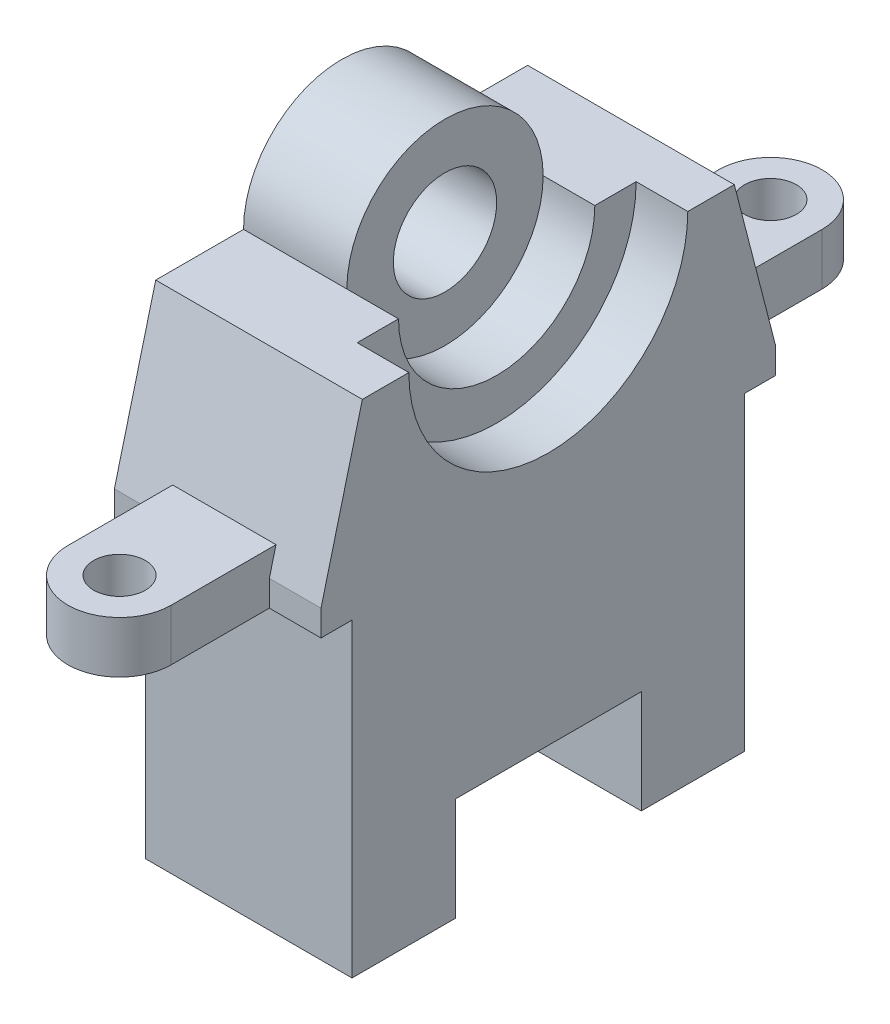
ISO-10303-21;
HEADER;
FILE_DESCRIPTION(('STEP AP214'),'2;1');
FILE_NAME('part.step','',(''),(''),'','','');
FILE_SCHEMA(('AUTOMOTIVE_DESIGN { 1 0 10303 214 1 1 1 1 }'));
ENDSEC;
DATA;
#1=APPLICATION_CONTEXT('core data for automotive mechanical design processes');
#2=APPLICATION_PROTOCOL_DEFINITION('international standard','automotive_design',2000,#1);
#3=PRODUCT_CONTEXT('',#1,'mechanical');
#4=PRODUCT('Part','Part','',(#3));
#5=PRODUCT_RELATED_PRODUCT_CATEGORY('part','',(#4));
#6=PRODUCT_DEFINITION_FORMATION('','',#4);
#7=PRODUCT_DEFINITION_CONTEXT('part definition',#1,'design');
#8=PRODUCT_DEFINITION('design','',#6,#7);
#9=PRODUCT_DEFINITION_SHAPE('','',#8);
#10=(LENGTH_UNIT() NAMED_UNIT(*) SI_UNIT(.MILLI.,.METRE.));
#11=(NAMED_UNIT(*) PLANE_ANGLE_UNIT() SI_UNIT($,.RADIAN.));
#12=(NAMED_UNIT(*) SI_UNIT($,.STERADIAN.) SOLID_ANGLE_UNIT());
#13=UNCERTAINTY_MEASURE_WITH_UNIT(LENGTH_MEASURE(1.E-05),#10,'distance_accuracy_value','');
#14=(GEOMETRIC_REPRESENTATION_CONTEXT(3) GLOBAL_UNCERTAINTY_ASSIGNED_CONTEXT((#13)) GLOBAL_UNIT_ASSIGNED_CONTEXT((#10,
#11,#12)) REPRESENTATION_CONTEXT('',''));
#15=CARTESIAN_POINT('',(0.,0.,0.));
#16=DIRECTION('',(0.,0.,1.));
#17=DIRECTION('',(1.,0.,0.));
#18=AXIS2_PLACEMENT_3D('',#15,#16,#17);
#19=CARTESIAN_POINT('',(40.,0.,44.));
#20=DIRECTION('',(0.,0.,-1.));
#21=DIRECTION('',(0.,1.,0.));
#22=AXIS2_PLACEMENT_3D('',#19,#20,#21);
#23=PLANE('',#22);
#24=DIRECTION('',(-1.,0.,0.));
#25=VECTOR('',#24,1.);
#26=CARTESIAN_POINT('',(40.,-31.,44.));
#27=LINE('',#26,#25);
#28=CARTESIAN_POINT('',(40.,-31.,44.));
#29=VERTEX_POINT('',#28);
#30=CARTESIAN_POINT('',(30.,-31.,44.));
#31=VERTEX_POINT('',#30);
#32=EDGE_CURVE('E494',#29,#31,#27,.T.);
#33=ORIENTED_EDGE('',*,*,#32,.T.);
#34=DIRECTION('',(0.,-1.,0.));
#35=VECTOR('',#34,1.);
#36=CARTESIAN_POINT('',(30.,0.,44.));
#37=LINE('',#36,#35);
#38=CARTESIAN_POINT('',(30.,-36.0000000000001,44.));
#39=VERTEX_POINT('',#38);
#40=EDGE_CURVE('E291',#31,#39,#37,.T.);
#41=ORIENTED_EDGE('',*,*,#40,.T.);
#42=DIRECTION('',(-1.,0.,0.));
#43=VECTOR('',#42,1.);
#44=CARTESIAN_POINT('',(40.,-36.,44.));
#45=LINE('',#44,#43);
#46=CARTESIAN_POINT('',(40.,-36.,44.));
#47=VERTEX_POINT('',#46);
#48=EDGE_CURVE('E244',#47,#39,#45,.T.);
#49=ORIENTED_EDGE('',*,*,#48,.F.);
#50=DIRECTION('',(0.,-1.,0.));
#51=VECTOR('',#50,1.);
#52=CARTESIAN_POINT('',(40.,0.,44.));
#53=LINE('',#52,#51);
#54=EDGE_CURVE('E352',#29,#47,#53,.T.);
#55=ORIENTED_EDGE('',*,*,#54,.F.);
#56=EDGE_LOOP('',(#33,#41,#49,#55));
#57=FACE_BOUND('',#56,.T.);
#58=ADVANCED_FACE('F45',(#57),#23,.F.);
#59=CARTESIAN_POINT('',(40.,0.,-44.));
#60=DIRECTION('',(0.,0.,-1.));
#61=DIRECTION('',(0.,1.,0.));
#62=AXIS2_PLACEMENT_3D('',#59,#60,#61);
#63=PLANE('',#62);
#64=DIRECTION('',(0.,-1.,0.));
#65=VECTOR('',#64,1.);
#66=CARTESIAN_POINT('',(30.,0.,-44.));
#67=LINE('',#66,#65);
#68=CARTESIAN_POINT('',(30.,-31.,-44.));
#69=VERTEX_POINT('',#68);
#70=CARTESIAN_POINT('',(30.,-36.,-44.));
#71=VERTEX_POINT('',#70);
#72=EDGE_CURVE('E337',#69,#71,#67,.T.);
#73=ORIENTED_EDGE('',*,*,#72,.F.);
#74=DIRECTION('',(-1.,0.,0.));
#75=VECTOR('',#74,1.);
#76=CARTESIAN_POINT('',(40.,-31.,-44.));
#77=LINE('',#76,#75);
#78=CARTESIAN_POINT('',(40.,-31.,-44.));
#79=VERTEX_POINT('',#78);
#80=EDGE_CURVE('E454',#79,#69,#77,.T.);
#81=ORIENTED_EDGE('',*,*,#80,.F.);
#82=DIRECTION('',(0.,-1.,0.));
#83=VECTOR('',#82,1.);
#84=CARTESIAN_POINT('',(40.,0.,-44.));
#85=LINE('',#84,#83);
#86=CARTESIAN_POINT('',(40.,-36.,-44.));
#87=VERTEX_POINT('',#86);
#88=EDGE_CURVE('E387',#79,#87,#85,.T.);
#89=ORIENTED_EDGE('',*,*,#88,.T.);
#90=DIRECTION('',(-1.,0.,0.));
#91=VECTOR('',#90,1.);
#92=CARTESIAN_POINT('',(40.,-36.,-44.));
#93=LINE('',#92,#91);
#94=EDGE_CURVE('E459',#87,#71,#93,.T.);
#95=ORIENTED_EDGE('',*,*,#94,.T.);
#96=EDGE_LOOP('',(#73,#81,#89,#95));
#97=FACE_BOUND('',#96,.T.);
#98=ADVANCED_FACE('F573',(#97),#63,.T.);
#99=CARTESIAN_POINT('',(20.,0.,0.));
#100=DIRECTION('',(-1.,0.,0.));
#101=DIRECTION('',(0.,0.,1.));
#102=AXIS2_PLACEMENT_3D('',#99,#100,#101);
#103=CYLINDRICAL_SURFACE('',#102,10.);
#104=CARTESIAN_POINT('',(20.,0.,0.));
#105=DIRECTION('',(1.,0.,0.));
#106=DIRECTION('',(0.,0.,-1.));
#107=AXIS2_PLACEMENT_3D('',#104,#105,#106);
#108=CIRCLE('',#107,10.);
#109=CARTESIAN_POINT('',(20.,0.,-10.));
#110=VERTEX_POINT('',#109);
#111=EDGE_CURVE('E544',#110,#110,#108,.T.);
#112=ORIENTED_EDGE('',*,*,#111,.T.);
#113=EDGE_LOOP('',(#112));
#114=FACE_BOUND('',#113,.T.);
#115=CARTESIAN_POINT('',(0.,0.,0.));
#116=DIRECTION('',(1.,0.,0.));
#117=DIRECTION('',(0.,0.,-1.));
#118=AXIS2_PLACEMENT_3D('',#115,#116,#117);
#119=CIRCLE('',#118,10.);
#120=CARTESIAN_POINT('',(0.,0.,-10.));
#121=VERTEX_POINT('',#120);
#122=EDGE_CURVE('E543',#121,#121,#119,.T.);
#123=ORIENTED_EDGE('',*,*,#122,.F.);
#124=EDGE_LOOP('',(#123));
#125=FACE_BOUND('',#124,.T.);
#126=ADVANCED_FACE('F47',(#114,#125),#103,.F.);
#127=CARTESIAN_POINT('',(20.,0.,0.));
#128=DIRECTION('',(-1.,0.,0.));
#129=DIRECTION('',(0.,0.,1.));
#130=AXIS2_PLACEMENT_3D('',#127,#128,#129);
#131=CYLINDRICAL_SURFACE('',#130,19.);
#132=CARTESIAN_POINT('',(0.,0.,0.));
#133=DIRECTION('',(1.,0.,0.));
#134=DIRECTION('',(0.,0.,-1.));
#135=AXIS2_PLACEMENT_3D('',#132,#133,#134);
#136=CIRCLE('',#135,19.);
#137=CARTESIAN_POINT('',(0.,0.,-19.));
#138=VERTEX_POINT('',#137);
#139=CARTESIAN_POINT('',(0.,0.,19.));
#140=VERTEX_POINT('',#139);
#141=EDGE_CURVE('E549',#138,#140,#136,.T.);
#142=ORIENTED_EDGE('',*,*,#141,.T.);
#143=DIRECTION('',(-1.,0.,0.));
#144=VECTOR('',#143,1.);
#145=CARTESIAN_POINT('',(30.,0.,19.));
#146=LINE('',#145,#144);
#147=CARTESIAN_POINT('',(20.,0.,19.));
#148=VERTEX_POINT('',#147);
#149=EDGE_CURVE('E524',#148,#140,#146,.T.);
#150=ORIENTED_EDGE('',*,*,#149,.F.);
#151=CARTESIAN_POINT('',(20.,0.,0.));
#152=DIRECTION('',(1.,0.,0.));
#153=DIRECTION('',(0.,0.,-1.));
#154=AXIS2_PLACEMENT_3D('',#151,#152,#153);
#155=CIRCLE('',#154,19.);
#156=CARTESIAN_POINT('',(20.,0.,-19.));
#157=VERTEX_POINT('',#156);
#158=EDGE_CURVE('E548',#157,#148,#155,.T.);
#159=ORIENTED_EDGE('',*,*,#158,.F.);
#160=DIRECTION('',(-1.,0.,0.));
#161=VECTOR('',#160,1.);
#162=CARTESIAN_POINT('',(30.,0.,-19.));
#163=LINE('',#162,#161);
#164=EDGE_CURVE('E534',#157,#138,#163,.T.);
#165=ORIENTED_EDGE('',*,*,#164,.T.);
#166=EDGE_LOOP('',(#142,#150,#159,#165));
#167=FACE_BOUND('',#166,.T.);
#168=ADVANCED_FACE('F663',(#167),#131,.T.);
#169=CARTESIAN_POINT('',(20.,0.,0.));
#170=DIRECTION('',(1.,0.,0.));
#171=DIRECTION('',(0.,0.,-1.));
#172=AXIS2_PLACEMENT_3D('',#169,#170,#171);
#173=PLANE('',#172);
#174=ORIENTED_EDGE('',*,*,#111,.F.);
#175=EDGE_LOOP('',(#174));
#176=FACE_BOUND('',#175,.T.);
#177=ORIENTED_EDGE('',*,*,#158,.T.);
#178=CARTESIAN_POINT('',(20.,0.,0.));
#179=DIRECTION('',(1.,0.,0.));
#180=DIRECTION('',(0.,0.,-1.));
#181=AXIS2_PLACEMENT_3D('',#178,#179,#180);
#182=CIRCLE('',#181,19.);
#183=EDGE_CURVE('E539',#157,#148,#182,.F.);
#184=ORIENTED_EDGE('',*,*,#183,.F.);
#185=EDGE_LOOP('',(#177,#184));
#186=FACE_BOUND('',#185,.T.);
#187=ADVANCED_FACE('F718',(#176,#186),#173,.T.);
#188=CARTESIAN_POINT('',(0.,0.,0.));
#189=DIRECTION('',(1.,0.,0.));
#190=DIRECTION('',(0.,0.,-1.));
#191=AXIS2_PLACEMENT_3D('',#188,#189,#190);
#192=PLANE('',#191);
#193=ORIENTED_EDGE('',*,*,#122,.T.);
#194=EDGE_LOOP('',(#193));
#195=FACE_BOUND('',#194,.T.);
#196=ORIENTED_EDGE('',*,*,#141,.F.);
#197=DIRECTION('',(0.,0.,-1.));
#198=VECTOR('',#197,1.);
#199=CARTESIAN_POINT('',(0.,0.,0.));
#200=LINE('',#199,#198);
#201=CARTESIAN_POINT('',(0.,0.,-36.));
#202=VERTEX_POINT('',#201);
#203=EDGE_CURVE('E512',#138,#202,#200,.T.);
#204=ORIENTED_EDGE('',*,*,#203,.T.);
#205=DIRECTION('',(0.,-0.968277323709358,-0.24987801902177));
#206=VECTOR('',#205,1.);
#207=CARTESIAN_POINT('',(0.,8.71024390243903,-33.7521951219512));
#208=LINE('',#207,#206);
#209=CARTESIAN_POINT('',(0.,-31.,-44.));
#210=VERTEX_POINT('',#209);
#211=EDGE_CURVE('E346',#202,#210,#208,.T.);
#212=ORIENTED_EDGE('',*,*,#211,.T.);
#213=DIRECTION('',(0.,-1.,0.));
#214=VECTOR('',#213,1.);
#215=CARTESIAN_POINT('',(0.,0.,-44.));
#216=LINE('',#215,#214);
#217=CARTESIAN_POINT('',(0.,-36.,-44.));
#218=VERTEX_POINT('',#217);
#219=EDGE_CURVE('E440',#210,#218,#216,.T.);
#220=ORIENTED_EDGE('',*,*,#219,.T.);
#221=DIRECTION('',(0.,0.,1.));
#222=VECTOR('',#221,1.);
#223=CARTESIAN_POINT('',(0.,-36.,0.));
#224=LINE('',#223,#222);
#225=CARTESIAN_POINT('',(0.,-36.,-38.));
#226=VERTEX_POINT('',#225);
#227=EDGE_CURVE('E436',#218,#226,#224,.T.);
#228=ORIENTED_EDGE('',*,*,#227,.T.);
#229=DIRECTION('',(0.,-1.,0.));
#230=VECTOR('',#229,1.);
#231=CARTESIAN_POINT('',(0.,0.,-38.));
#232=LINE('',#231,#230);
#233=CARTESIAN_POINT('',(0.,-96.,-38.));
#234=VERTEX_POINT('',#233);
#235=EDGE_CURVE('E432',#226,#234,#232,.T.);
#236=ORIENTED_EDGE('',*,*,#235,.T.);
#237=DIRECTION('',(0.,0.,1.));
#238=VECTOR('',#237,1.);
#239=CARTESIAN_POINT('',(0.,-96.,0.));
#240=LINE('',#239,#238);
#241=CARTESIAN_POINT('',(0.,-96.,-18.));
#242=VERTEX_POINT('',#241);
#243=EDGE_CURVE('E428',#234,#242,#240,.T.);
#244=ORIENTED_EDGE('',*,*,#243,.T.);
#245=DIRECTION('',(0.,1.,0.));
#246=VECTOR('',#245,1.);
#247=CARTESIAN_POINT('',(0.,0.,-18.));
#248=LINE('',#247,#246);
#249=CARTESIAN_POINT('',(0.,-76.,-18.));
#250=VERTEX_POINT('',#249);
#251=EDGE_CURVE('E424',#242,#250,#248,.T.);
#252=ORIENTED_EDGE('',*,*,#251,.T.);
#253=DIRECTION('',(0.,0.,1.));
#254=VECTOR('',#253,1.);
#255=CARTESIAN_POINT('',(0.,-76.,0.));
#256=LINE('',#255,#254);
#257=CARTESIAN_POINT('',(0.,-76.,18.));
#258=VERTEX_POINT('',#257);
#259=EDGE_CURVE('E420',#250,#258,#256,.T.);
#260=ORIENTED_EDGE('',*,*,#259,.T.);
#261=DIRECTION('',(0.,1.,0.));
#262=VECTOR('',#261,1.);
#263=CARTESIAN_POINT('',(0.,0.,18.));
#264=LINE('',#263,#262);
#265=CARTESIAN_POINT('',(0.,-96.,18.));
#266=VERTEX_POINT('',#265);
#267=EDGE_CURVE('E416',#266,#258,#264,.T.);
#268=ORIENTED_EDGE('',*,*,#267,.F.);
#269=DIRECTION('',(0.,0.,-1.));
#270=VECTOR('',#269,1.);
#271=CARTESIAN_POINT('',(0.,-96.,0.));
#272=LINE('',#271,#270);
#273=CARTESIAN_POINT('',(0.,-96.,38.));
#274=VERTEX_POINT('',#273);
#275=EDGE_CURVE('E413',#274,#266,#272,.T.);
#276=ORIENTED_EDGE('',*,*,#275,.F.);
#277=DIRECTION('',(0.,-1.,0.));
#278=VECTOR('',#277,1.);
#279=CARTESIAN_POINT('',(0.,0.,38.));
#280=LINE('',#279,#278);
#281=CARTESIAN_POINT('',(0.,-36.,38.));
#282=VERTEX_POINT('',#281);
#283=EDGE_CURVE('E410',#282,#274,#280,.T.);
#284=ORIENTED_EDGE('',*,*,#283,.F.);
#285=DIRECTION('',(0.,0.,-1.));
#286=VECTOR('',#285,1.);
#287=CARTESIAN_POINT('',(0.,-36.,0.));
#288=LINE('',#287,#286);
#289=CARTESIAN_POINT('',(0.,-36.,44.));
#290=VERTEX_POINT('',#289);
#291=EDGE_CURVE('E407',#290,#282,#288,.T.);
#292=ORIENTED_EDGE('',*,*,#291,.F.);
#293=DIRECTION('',(0.,-1.,0.));
#294=VECTOR('',#293,1.);
#295=CARTESIAN_POINT('',(0.,0.,44.));
#296=LINE('',#295,#294);
#297=CARTESIAN_POINT('',(0.,-31.,44.));
#298=VERTEX_POINT('',#297);
#299=EDGE_CURVE('E403',#298,#290,#296,.T.);
#300=ORIENTED_EDGE('',*,*,#299,.F.);
#301=DIRECTION('',(0.,-0.968277323709358,0.24987801902177));
#302=VECTOR('',#301,1.);
#303=CARTESIAN_POINT('',(0.,8.71024390243903,33.7521951219512));
#304=LINE('',#303,#302);
#305=CARTESIAN_POINT('',(0.,0.,36.));
#306=VERTEX_POINT('',#305);
#307=EDGE_CURVE('E340',#306,#298,#304,.T.);
#308=ORIENTED_EDGE('',*,*,#307,.F.);
#309=DIRECTION('',(0.,0.,-1.));
#310=VECTOR('',#309,1.);
#311=CARTESIAN_POINT('',(0.,0.,0.));
#312=LINE('',#311,#310);
#313=EDGE_CURVE('E506',#306,#140,#312,.T.);
#314=ORIENTED_EDGE('',*,*,#313,.T.);
#315=EDGE_LOOP('',(#196,#204,#212,#220,#228,#236,#244,#252,#260,#268,#276,#284,#292,#300,#308,#314));
#316=FACE_BOUND('',#315,.T.);
#317=ADVANCED_FACE('F665',(#195,#316),#192,.F.);
#318=CARTESIAN_POINT('',(30.,0.,0.));
#319=DIRECTION('',(0.,1.,0.));
#320=DIRECTION('',(0.,0.,1.));
#321=AXIS2_PLACEMENT_3D('',#318,#319,#320);
#322=PLANE('',#321);
#323=ORIENTED_EDGE('',*,*,#313,.F.);
#324=DIRECTION('',(-1.,0.,0.));
#325=VECTOR('',#324,1.);
#326=CARTESIAN_POINT('',(40.,0.,36.));
#327=LINE('',#326,#325);
#328=CARTESIAN_POINT('',(40.,0.,36.));
#329=VERTEX_POINT('',#328);
#330=EDGE_CURVE('E498',#329,#306,#327,.T.);
#331=ORIENTED_EDGE('',*,*,#330,.F.);
#332=DIRECTION('',(0.,0.,1.));
#333=VECTOR('',#332,1.);
#334=CARTESIAN_POINT('',(40.,0.,0.));
#335=LINE('',#334,#333);
#336=CARTESIAN_POINT('',(40.,0.,27.));
#337=VERTEX_POINT('',#336);
#338=EDGE_CURVE('E345',#337,#329,#335,.T.);
#339=ORIENTED_EDGE('',*,*,#338,.F.);
#340=DIRECTION('',(-1.,0.,0.));
#341=VECTOR('',#340,1.);
#342=CARTESIAN_POINT('',(40.,0.,27.));
#343=LINE('',#342,#341);
#344=CARTESIAN_POINT('',(30.,0.,27.));
#345=VERTEX_POINT('',#344);
#346=EDGE_CURVE('E502',#337,#345,#343,.T.);
#347=ORIENTED_EDGE('',*,*,#346,.T.);
#348=DIRECTION('',(0.,0.,-1.));
#349=VECTOR('',#348,1.);
#350=CARTESIAN_POINT('',(30.,0.,0.));
#351=LINE('',#350,#349);
#352=CARTESIAN_POINT('',(30.,0.,19.));
#353=VERTEX_POINT('',#352);
#354=EDGE_CURVE('E507',#345,#353,#351,.T.);
#355=ORIENTED_EDGE('',*,*,#354,.T.);
#356=EDGE_CURVE('E530',#353,#148,#146,.T.);
#357=ORIENTED_EDGE('',*,*,#356,.T.);
#358=ORIENTED_EDGE('',*,*,#149,.T.);
#359=EDGE_LOOP('',(#323,#331,#339,#347,#355,#357,#358));
#360=FACE_BOUND('',#359,.T.);
#361=ADVANCED_FACE('F594',(#360),#322,.T.);
#362=CARTESIAN_POINT('',(30.,0.,0.));
#363=DIRECTION('',(0.,1.,0.));
#364=DIRECTION('',(0.,0.,1.));
#365=AXIS2_PLACEMENT_3D('',#362,#363,#364);
#366=PLANE('',#365);
#367=ORIENTED_EDGE('',*,*,#203,.F.);
#368=ORIENTED_EDGE('',*,*,#164,.F.);
#369=CARTESIAN_POINT('',(30.,0.,-19.));
#370=VERTEX_POINT('',#369);
#371=EDGE_CURVE('E535',#370,#157,#163,.T.);
#372=ORIENTED_EDGE('',*,*,#371,.F.);
#373=DIRECTION('',(0.,0.,-1.));
#374=VECTOR('',#373,1.);
#375=CARTESIAN_POINT('',(30.,0.,0.));
#376=LINE('',#375,#374);
#377=CARTESIAN_POINT('',(30.,0.,-27.));
#378=VERTEX_POINT('',#377);
#379=EDGE_CURVE('E516',#370,#378,#376,.T.);
#380=ORIENTED_EDGE('',*,*,#379,.T.);
#381=DIRECTION('',(-1.,0.,0.));
#382=VECTOR('',#381,1.);
#383=CARTESIAN_POINT('',(40.,0.,-27.));
#384=LINE('',#383,#382);
#385=CARTESIAN_POINT('',(40.,0.,-27.));
#386=VERTEX_POINT('',#385);
#387=EDGE_CURVE('E399',#386,#378,#384,.T.);
#388=ORIENTED_EDGE('',*,*,#387,.F.);
#389=DIRECTION('',(0.,0.,-1.));
#390=VECTOR('',#389,1.);
#391=CARTESIAN_POINT('',(40.,0.,0.));
#392=LINE('',#391,#390);
#393=CARTESIAN_POINT('',(40.,0.,-36.));
#394=VERTEX_POINT('',#393);
#395=EDGE_CURVE('E395',#386,#394,#392,.T.);
#396=ORIENTED_EDGE('',*,*,#395,.T.);
#397=DIRECTION('',(-1.,0.,0.));
#398=VECTOR('',#397,1.);
#399=CARTESIAN_POINT('',(40.,0.,-36.));
#400=LINE('',#399,#398);
#401=EDGE_CURVE('E449',#394,#202,#400,.T.);
#402=ORIENTED_EDGE('',*,*,#401,.T.);
#403=EDGE_LOOP('',(#367,#368,#372,#380,#388,#396,#402));
#404=FACE_BOUND('',#403,.T.);
#405=ADVANCED_FACE('F585',(#404),#366,.T.);
#406=CARTESIAN_POINT('',(30.,0.,0.));
#407=DIRECTION('',(-1.,0.,0.));
#408=DIRECTION('',(0.,0.,1.));
#409=AXIS2_PLACEMENT_3D('',#406,#407,#408);
#410=CYLINDRICAL_SURFACE('',#409,19.);
#411=ORIENTED_EDGE('',*,*,#371,.T.);
#412=ORIENTED_EDGE('',*,*,#183,.T.);
#413=ORIENTED_EDGE('',*,*,#356,.F.);
#414=CARTESIAN_POINT('',(30.,0.,0.));
#415=DIRECTION('',(1.,0.,0.));
#416=DIRECTION('',(0.,0.,-1.));
#417=AXIS2_PLACEMENT_3D('',#414,#415,#416);
#418=CIRCLE('',#417,19.);
#419=EDGE_CURVE('E520',#353,#370,#418,.T.);
#420=ORIENTED_EDGE('',*,*,#419,.T.);
#421=EDGE_LOOP('',(#411,#412,#413,#420));
#422=FACE_BOUND('',#421,.T.);
#423=ADVANCED_FACE('F709',(#422),#410,.F.);
#424=CARTESIAN_POINT('',(30.,0.,0.));
#425=DIRECTION('',(1.,0.,0.));
#426=DIRECTION('',(0.,0.,-1.));
#427=AXIS2_PLACEMENT_3D('',#424,#425,#426);
#428=PLANE('',#427);
#429=ORIENTED_EDGE('',*,*,#354,.F.);
#430=CARTESIAN_POINT('',(30.,0.,0.));
#431=DIRECTION('',(1.,0.,0.));
#432=DIRECTION('',(0.,0.,-1.));
#433=AXIS2_PLACEMENT_3D('',#430,#431,#432);
#434=CIRCLE('',#433,27.);
#435=EDGE_CURVE('E511',#345,#378,#434,.T.);
#436=ORIENTED_EDGE('',*,*,#435,.T.);
#437=ORIENTED_EDGE('',*,*,#379,.F.);
#438=ORIENTED_EDGE('',*,*,#419,.F.);
#439=EDGE_LOOP('',(#429,#436,#437,#438));
#440=FACE_BOUND('',#439,.T.);
#441=ADVANCED_FACE('F704',(#440),#428,.T.);
#442=CARTESIAN_POINT('',(40.,0.,0.));
#443=DIRECTION('',(-1.,0.,0.));
#444=DIRECTION('',(0.,0.,1.));
#445=AXIS2_PLACEMENT_3D('',#442,#443,#444);
#446=CYLINDRICAL_SURFACE('',#445,27.);
#447=ORIENTED_EDGE('',*,*,#387,.T.);
#448=ORIENTED_EDGE('',*,*,#435,.F.);
#449=ORIENTED_EDGE('',*,*,#346,.F.);
#450=CARTESIAN_POINT('',(40.,0.,0.));
#451=DIRECTION('',(1.,0.,0.));
#452=DIRECTION('',(0.,0.,-1.));
#453=AXIS2_PLACEMENT_3D('',#450,#451,#452);
#454=CIRCLE('',#453,27.);
#455=EDGE_CURVE('E341',#337,#386,#454,.T.);
#456=ORIENTED_EDGE('',*,*,#455,.T.);
#457=EDGE_LOOP('',(#447,#448,#449,#456));
#458=FACE_BOUND('',#457,.T.);
#459=ADVANCED_FACE('F588',(#458),#446,.F.);
#460=CARTESIAN_POINT('',(40.,8.71024390243903,33.7521951219512));
#461=DIRECTION('',(0.,-0.24987801902177,-0.968277323709358));
#462=DIRECTION('',(0.,0.968277323709358,-0.24987801902177));
#463=AXIS2_PLACEMENT_3D('',#460,#461,#462);
#464=PLANE('',#463);
#465=DIRECTION('',(1.,0.,0.));
#466=VECTOR('',#465,1.);
#467=CARTESIAN_POINT('',(40.,-26.0000000000001,42.7096774193549));
#468=LINE('',#467,#466);
#469=CARTESIAN_POINT('',(10.,-26.0000000000001,42.7096774193549));
#470=VERTEX_POINT('',#469);
#471=CARTESIAN_POINT('',(30.,-26.0000000000001,42.7096774193549));
#472=VERTEX_POINT('',#471);
#473=EDGE_CURVE('E11',#470,#472,#468,.T.);
#474=ORIENTED_EDGE('',*,*,#473,.T.);
#475=DIRECTION('',(0.,-0.968277323709358,0.24987801902177));
#476=VECTOR('',#475,1.);
#477=CARTESIAN_POINT('',(30.,8.71024390243903,33.7521951219512));
#478=LINE('',#477,#476);
#479=EDGE_CURVE('E294',#472,#31,#478,.T.);
#480=ORIENTED_EDGE('',*,*,#479,.T.);
#481=ORIENTED_EDGE('',*,*,#32,.F.);
#482=DIRECTION('',(0.,-0.968277323709358,0.24987801902177));
#483=VECTOR('',#482,1.);
#484=CARTESIAN_POINT('',(40.,8.71024390243903,33.7521951219512));
#485=LINE('',#484,#483);
#486=EDGE_CURVE('E349',#329,#29,#485,.T.);
#487=ORIENTED_EDGE('',*,*,#486,.F.);
#488=ORIENTED_EDGE('',*,*,#330,.T.);
#489=ORIENTED_EDGE('',*,*,#307,.T.);
#490=CARTESIAN_POINT('',(10.,-31.,44.));
#491=VERTEX_POINT('',#490);
#492=EDGE_CURVE('E493',#491,#298,#27,.T.);
#493=ORIENTED_EDGE('',*,*,#492,.F.);
#494=DIRECTION('',(0.,0.968277323709358,-0.24987801902177));
#495=VECTOR('',#494,1.);
#496=CARTESIAN_POINT('',(10.,8.71024390243903,33.7521951219512));
#497=LINE('',#496,#495);
#498=EDGE_CURVE('E287',#491,#470,#497,.T.);
#499=ORIENTED_EDGE('',*,*,#498,.T.);
#500=EDGE_LOOP('',(#474,#480,#481,#487,#488,#489,#493,#499));
#501=FACE_BOUND('',#500,.T.);
#502=ADVANCED_FACE('F598',(#501),#464,.F.);
#503=CARTESIAN_POINT('',(10.,-36.,44.));
#504=VERTEX_POINT('',#503);
#505=EDGE_CURVE('E490',#504,#290,#45,.T.);
#506=ORIENTED_EDGE('',*,*,#505,.F.);
#507=DIRECTION('',(0.,1.,0.));
#508=VECTOR('',#507,1.);
#509=CARTESIAN_POINT('',(10.,0.,44.));
#510=LINE('',#509,#508);
#511=EDGE_CURVE('E282',#504,#491,#510,.T.);
#512=ORIENTED_EDGE('',*,*,#511,.T.);
#513=ORIENTED_EDGE('',*,*,#492,.T.);
#514=ORIENTED_EDGE('',*,*,#299,.T.);
#515=EDGE_LOOP('',(#506,#512,#513,#514));
#516=FACE_BOUND('',#515,.T.);
#517=ADVANCED_FACE('F670',(#516),#23,.F.);
#518=CARTESIAN_POINT('',(40.,-36.,0.));
#519=DIRECTION('',(0.,1.,0.));
#520=DIRECTION('',(0.,0.,1.));
#521=AXIS2_PLACEMENT_3D('',#518,#519,#520);
#522=PLANE('',#521);
#523=ORIENTED_EDGE('',*,*,#48,.T.);
#524=DIRECTION('',(0.,0.,1.));
#525=VECTOR('',#524,1.);
#526=CARTESIAN_POINT('',(30.,-36.0000000000001,42.0000000000001));
#527=LINE('',#526,#525);
#528=CARTESIAN_POINT('',(30.,-36.0000000000001,63.));
#529=VERTEX_POINT('',#528);
#530=EDGE_CURVE('E236',#39,#529,#527,.T.);
#531=ORIENTED_EDGE('',*,*,#530,.T.);
#532=CARTESIAN_POINT('',(20.,-36.0000000000001,63.));
#533=DIRECTION('',(0.,-1.,0.));
#534=DIRECTION('',(0.,0.,1.));
#535=AXIS2_PLACEMENT_3D('',#532,#533,#534);
#536=CIRCLE('',#535,10.);
#537=CARTESIAN_POINT('',(9.99999999999999,-36.0000000000001,63.));
#538=VERTEX_POINT('',#537);
#539=EDGE_CURVE('E241',#529,#538,#536,.T.);
#540=ORIENTED_EDGE('',*,*,#539,.T.);
#541=DIRECTION('',(0.,0.,-1.));
#542=VECTOR('',#541,1.);
#543=CARTESIAN_POINT('',(9.99999999999999,-36.0000000000001,63.));
#544=LINE('',#543,#542);
#545=EDGE_CURVE('E61',#538,#504,#544,.T.);
#546=ORIENTED_EDGE('',*,*,#545,.T.);
#547=ORIENTED_EDGE('',*,*,#505,.T.);
#548=ORIENTED_EDGE('',*,*,#291,.T.);
#549=DIRECTION('',(-1.,0.,0.));
#550=VECTOR('',#549,1.);
#551=CARTESIAN_POINT('',(40.,-36.,38.));
#552=LINE('',#551,#550);
#553=CARTESIAN_POINT('',(40.,-36.,38.));
#554=VERTEX_POINT('',#553);
#555=EDGE_CURVE('E486',#554,#282,#552,.T.);
#556=ORIENTED_EDGE('',*,*,#555,.F.);
#557=DIRECTION('',(0.,0.,-1.));
#558=VECTOR('',#557,1.);
#559=CARTESIAN_POINT('',(40.,-36.,0.));
#560=LINE('',#559,#558);
#561=EDGE_CURVE('E355',#47,#554,#560,.T.);
#562=ORIENTED_EDGE('',*,*,#561,.F.);
#563=EDGE_LOOP('',(#523,#531,#540,#546,#547,#548,#556,#562));
#564=FACE_BOUND('',#563,.T.);
#565=CARTESIAN_POINT('',(20.,-36.0000000000001,63.));
#566=DIRECTION('',(0.,-1.,0.));
#567=DIRECTION('',(0.,0.,1.));
#568=AXIS2_PLACEMENT_3D('',#565,#566,#567);
#569=CIRCLE('',#568,5.);
#570=CARTESIAN_POINT('',(20.,-36.0000000000001,68.));
#571=VERTEX_POINT('',#570);
#572=EDGE_CURVE('E268',#571,#571,#569,.T.);
#573=ORIENTED_EDGE('',*,*,#572,.F.);
#574=EDGE_LOOP('',(#573));
#575=FACE_BOUND('',#574,.T.);
#576=ADVANCED_FACE('F238',(#564,#575),#522,.F.);
#577=CARTESIAN_POINT('',(40.,0.,38.));
#578=DIRECTION('',(0.,0.,-1.));
#579=DIRECTION('',(0.,1.,0.));
#580=AXIS2_PLACEMENT_3D('',#577,#578,#579);
#581=PLANE('',#580);
#582=ORIENTED_EDGE('',*,*,#283,.T.);
#583=DIRECTION('',(-1.,0.,0.));
#584=VECTOR('',#583,1.);
#585=CARTESIAN_POINT('',(40.,-96.,38.));
#586=LINE('',#585,#584);
#587=CARTESIAN_POINT('',(40.,-96.,38.));
#588=VERTEX_POINT('',#587);
#589=EDGE_CURVE('E482',#588,#274,#586,.T.);
#590=ORIENTED_EDGE('',*,*,#589,.F.);
#591=DIRECTION('',(0.,-1.,0.));
#592=VECTOR('',#591,1.);
#593=CARTESIAN_POINT('',(40.,0.,38.));
#594=LINE('',#593,#592);
#595=EDGE_CURVE('E358',#554,#588,#594,.T.);
#596=ORIENTED_EDGE('',*,*,#595,.F.);
#597=ORIENTED_EDGE('',*,*,#555,.T.);
#598=EDGE_LOOP('',(#582,#590,#596,#597));
#599=FACE_BOUND('',#598,.T.);
#600=ADVANCED_FACE('F607',(#599),#581,.F.);
#601=CARTESIAN_POINT('',(40.,-96.,0.));
#602=DIRECTION('',(0.,1.,0.));
#603=DIRECTION('',(0.,0.,1.));
#604=AXIS2_PLACEMENT_3D('',#601,#602,#603);
#605=PLANE('',#604);
#606=ORIENTED_EDGE('',*,*,#275,.T.);
#607=DIRECTION('',(-1.,0.,0.));
#608=VECTOR('',#607,1.);
#609=CARTESIAN_POINT('',(40.,-96.,18.));
#610=LINE('',#609,#608);
#611=CARTESIAN_POINT('',(40.,-96.,18.));
#612=VERTEX_POINT('',#611);
#613=EDGE_CURVE('E478',#612,#266,#610,.T.);
#614=ORIENTED_EDGE('',*,*,#613,.F.);
#615=DIRECTION('',(0.,0.,-1.));
#616=VECTOR('',#615,1.);
#617=CARTESIAN_POINT('',(40.,-96.,0.));
#618=LINE('',#617,#616);
#619=EDGE_CURVE('E361',#588,#612,#618,.T.);
#620=ORIENTED_EDGE('',*,*,#619,.F.);
#621=ORIENTED_EDGE('',*,*,#589,.T.);
#622=EDGE_LOOP('',(#606,#614,#620,#621));
#623=FACE_BOUND('',#622,.T.);
#624=ADVANCED_FACE('F612',(#623),#605,.F.);
#625=CARTESIAN_POINT('',(40.,0.,18.));
#626=DIRECTION('',(0.,0.,1.));
#627=DIRECTION('',(1.,0.,0.));
#628=AXIS2_PLACEMENT_3D('',#625,#626,#627);
#629=PLANE('',#628);
#630=ORIENTED_EDGE('',*,*,#267,.T.);
#631=DIRECTION('',(-1.,0.,0.));
#632=VECTOR('',#631,1.);
#633=CARTESIAN_POINT('',(40.,-76.,18.));
#634=LINE('',#633,#632);
#635=CARTESIAN_POINT('',(40.,-76.,18.));
#636=VERTEX_POINT('',#635);
#637=EDGE_CURVE('E475',#636,#258,#634,.T.);
#638=ORIENTED_EDGE('',*,*,#637,.F.);
#639=DIRECTION('',(0.,1.,0.));
#640=VECTOR('',#639,1.);
#641=CARTESIAN_POINT('',(40.,0.,18.));
#642=LINE('',#641,#640);
#643=EDGE_CURVE('E364',#612,#636,#642,.T.);
#644=ORIENTED_EDGE('',*,*,#643,.F.);
#645=ORIENTED_EDGE('',*,*,#613,.T.);
#646=EDGE_LOOP('',(#630,#638,#644,#645));
#647=FACE_BOUND('',#646,.T.);
#648=ADVANCED_FACE('F618',(#647),#629,.F.);
#649=CARTESIAN_POINT('',(40.,-76.,0.));
#650=DIRECTION('',(0.,-1.,0.));
#651=DIRECTION('',(0.,0.,-1.));
#652=AXIS2_PLACEMENT_3D('',#649,#650,#651);
#653=PLANE('',#652);
#654=ORIENTED_EDGE('',*,*,#259,.F.);
#655=DIRECTION('',(-1.,0.,0.));
#656=VECTOR('',#655,1.);
#657=CARTESIAN_POINT('',(40.,-76.,-18.));
#658=LINE('',#657,#656);
#659=CARTESIAN_POINT('',(40.,-76.,-18.));
#660=VERTEX_POINT('',#659);
#661=EDGE_CURVE('E472',#660,#250,#658,.T.);
#662=ORIENTED_EDGE('',*,*,#661,.F.);
#663=DIRECTION('',(0.,0.,1.));
#664=VECTOR('',#663,1.);
#665=CARTESIAN_POINT('',(40.,-76.,0.));
#666=LINE('',#665,#664);
#667=EDGE_CURVE('E367',#660,#636,#666,.T.);
#668=ORIENTED_EDGE('',*,*,#667,.T.);
#669=ORIENTED_EDGE('',*,*,#637,.T.);
#670=EDGE_LOOP('',(#654,#662,#668,#669));
#671=FACE_BOUND('',#670,.T.);
#672=ADVANCED_FACE('F622',(#671),#653,.T.);
#673=CARTESIAN_POINT('',(40.,0.,-18.));
#674=DIRECTION('',(0.,0.,1.));
#675=DIRECTION('',(1.,0.,0.));
#676=AXIS2_PLACEMENT_3D('',#673,#674,#675);
#677=PLANE('',#676);
#678=ORIENTED_EDGE('',*,*,#251,.F.);
#679=DIRECTION('',(-1.,0.,0.));
#680=VECTOR('',#679,1.);
#681=CARTESIAN_POINT('',(40.,-96.,-18.));
#682=LINE('',#681,#680);
#683=CARTESIAN_POINT('',(40.,-96.,-18.));
#684=VERTEX_POINT('',#683);
#685=EDGE_CURVE('E469',#684,#242,#682,.T.);
#686=ORIENTED_EDGE('',*,*,#685,.F.);
#687=DIRECTION('',(0.,1.,0.));
#688=VECTOR('',#687,1.);
#689=CARTESIAN_POINT('',(40.,0.,-18.));
#690=LINE('',#689,#688);
#691=EDGE_CURVE('E371',#684,#660,#690,.T.);
#692=ORIENTED_EDGE('',*,*,#691,.T.);
#693=ORIENTED_EDGE('',*,*,#661,.T.);
#694=EDGE_LOOP('',(#678,#686,#692,#693));
#695=FACE_BOUND('',#694,.T.);
#696=ADVANCED_FACE('F625',(#695),#677,.T.);
#697=CARTESIAN_POINT('',(40.,-96.,0.));
#698=DIRECTION('',(0.,-1.,0.));
#699=DIRECTION('',(0.,0.,-1.));
#700=AXIS2_PLACEMENT_3D('',#697,#698,#699);
#701=PLANE('',#700);
#702=ORIENTED_EDGE('',*,*,#243,.F.);
#703=DIRECTION('',(-1.,0.,0.));
#704=VECTOR('',#703,1.);
#705=CARTESIAN_POINT('',(40.,-96.,-38.));
#706=LINE('',#705,#704);
#707=CARTESIAN_POINT('',(40.,-96.,-38.));
#708=VERTEX_POINT('',#707);
#709=EDGE_CURVE('E466',#708,#234,#706,.T.);
#710=ORIENTED_EDGE('',*,*,#709,.F.);
#711=DIRECTION('',(0.,0.,1.));
#712=VECTOR('',#711,1.);
#713=CARTESIAN_POINT('',(40.,-96.,0.));
#714=LINE('',#713,#712);
#715=EDGE_CURVE('E375',#708,#684,#714,.T.);
#716=ORIENTED_EDGE('',*,*,#715,.T.);
#717=ORIENTED_EDGE('',*,*,#685,.T.);
#718=EDGE_LOOP('',(#702,#710,#716,#717));
#719=FACE_BOUND('',#718,.T.);
#720=ADVANCED_FACE('F630',(#719),#701,.T.);
#721=CARTESIAN_POINT('',(40.,0.,-38.));
#722=DIRECTION('',(0.,0.,-1.));
#723=DIRECTION('',(0.,1.,0.));
#724=AXIS2_PLACEMENT_3D('',#721,#722,#723);
#725=PLANE('',#724);
#726=ORIENTED_EDGE('',*,*,#235,.F.);
#727=DIRECTION('',(-1.,0.,0.));
#728=VECTOR('',#727,1.);
#729=CARTESIAN_POINT('',(40.,-36.,-38.));
#730=LINE('',#729,#728);
#731=CARTESIAN_POINT('',(40.,-36.,-38.));
#732=VERTEX_POINT('',#731);
#733=EDGE_CURVE('E463',#732,#226,#730,.T.);
#734=ORIENTED_EDGE('',*,*,#733,.F.);
#735=DIRECTION('',(0.,-1.,0.));
#736=VECTOR('',#735,1.);
#737=CARTESIAN_POINT('',(40.,0.,-38.));
#738=LINE('',#737,#736);
#739=EDGE_CURVE('E379',#732,#708,#738,.T.);
#740=ORIENTED_EDGE('',*,*,#739,.T.);
#741=ORIENTED_EDGE('',*,*,#709,.T.);
#742=EDGE_LOOP('',(#726,#734,#740,#741));
#743=FACE_BOUND('',#742,.T.);
#744=ADVANCED_FACE('F633',(#743),#725,.T.);
#745=CARTESIAN_POINT('',(40.,-36.,0.));
#746=DIRECTION('',(0.,-1.,0.));
#747=DIRECTION('',(0.,0.,-1.));
#748=AXIS2_PLACEMENT_3D('',#745,#746,#747);
#749=PLANE('',#748);
#750=CARTESIAN_POINT('',(10.,-36.,-44.));
#751=VERTEX_POINT('',#750);
#752=EDGE_CURVE('E458',#751,#218,#93,.T.);
#753=ORIENTED_EDGE('',*,*,#752,.F.);
#754=DIRECTION('',(0.,0.,-1.));
#755=VECTOR('',#754,1.);
#756=CARTESIAN_POINT('',(9.99999999999999,-36.,-62.9999999999999));
#757=LINE('',#756,#755);
#758=CARTESIAN_POINT('',(9.99999999999999,-36.,-62.9999999999999));
#759=VERTEX_POINT('',#758);
#760=EDGE_CURVE('E322',#751,#759,#757,.T.);
#761=ORIENTED_EDGE('',*,*,#760,.T.);
#762=CARTESIAN_POINT('',(20.,-36.,-62.9999999999999));
#763=DIRECTION('',(0.,-1.,0.));
#764=DIRECTION('',(0.,0.,-1.));
#765=AXIS2_PLACEMENT_3D('',#762,#763,#764);
#766=CIRCLE('',#765,10.);
#767=CARTESIAN_POINT('',(30.,-36.,-62.9999999999999));
#768=VERTEX_POINT('',#767);
#769=EDGE_CURVE('E311',#759,#768,#766,.T.);
#770=ORIENTED_EDGE('',*,*,#769,.T.);
#771=DIRECTION('',(0.,0.,1.));
#772=VECTOR('',#771,1.);
#773=CARTESIAN_POINT('',(30.,-36.,-42.));
#774=LINE('',#773,#772);
#775=EDGE_CURVE('E303',#768,#71,#774,.T.);
#776=ORIENTED_EDGE('',*,*,#775,.T.);
#777=ORIENTED_EDGE('',*,*,#94,.F.);
#778=DIRECTION('',(0.,0.,1.));
#779=VECTOR('',#778,1.);
#780=CARTESIAN_POINT('',(40.,-36.,0.));
#781=LINE('',#780,#779);
#782=EDGE_CURVE('E383',#87,#732,#781,.T.);
#783=ORIENTED_EDGE('',*,*,#782,.T.);
#784=ORIENTED_EDGE('',*,*,#733,.T.);
#785=ORIENTED_EDGE('',*,*,#227,.F.);
#786=EDGE_LOOP('',(#753,#761,#770,#776,#777,#783,#784,#785));
#787=FACE_BOUND('',#786,.T.);
#788=CARTESIAN_POINT('',(20.,-36.,-62.9999999999999));
#789=DIRECTION('',(0.,-1.,0.));
#790=DIRECTION('',(0.,0.,-1.));
#791=AXIS2_PLACEMENT_3D('',#788,#789,#790);
#792=CIRCLE('',#791,5.);
#793=CARTESIAN_POINT('',(20.,-36.,-67.9999999999999));
#794=VERTEX_POINT('',#793);
#795=EDGE_CURVE('E298',#794,#794,#792,.T.);
#796=ORIENTED_EDGE('',*,*,#795,.F.);
#797=EDGE_LOOP('',(#796));
#798=FACE_BOUND('',#797,.T.);
#799=ADVANCED_FACE('F636',(#787,#798),#749,.T.);
#800=DIRECTION('',(0.,1.,0.));
#801=VECTOR('',#800,1.);
#802=CARTESIAN_POINT('',(10.,0.,-44.));
#803=LINE('',#802,#801);
#804=CARTESIAN_POINT('',(10.,-31.,-44.));
#805=VERTEX_POINT('',#804);
#806=EDGE_CURVE('E331',#751,#805,#803,.T.);
#807=ORIENTED_EDGE('',*,*,#806,.F.);
#808=ORIENTED_EDGE('',*,*,#752,.T.);
#809=ORIENTED_EDGE('',*,*,#219,.F.);
#810=EDGE_CURVE('E453',#805,#210,#77,.T.);
#811=ORIENTED_EDGE('',*,*,#810,.F.);
#812=EDGE_LOOP('',(#807,#808,#809,#811));
#813=FACE_BOUND('',#812,.T.);
#814=ADVANCED_FACE('F652',(#813),#63,.T.);
#815=CARTESIAN_POINT('',(40.,8.71024390243903,-33.7521951219512));
#816=DIRECTION('',(0.,0.24987801902177,-0.968277323709358));
#817=DIRECTION('',(0.,0.968277323709358,0.24987801902177));
#818=AXIS2_PLACEMENT_3D('',#815,#816,#817);
#819=PLANE('',#818);
#820=DIRECTION('',(0.,-0.968277323709358,-0.24987801902177));
#821=VECTOR('',#820,1.);
#822=CARTESIAN_POINT('',(30.,8.71024390243903,-33.7521951219512));
#823=LINE('',#822,#821);
#824=CARTESIAN_POINT('',(30.,-26.,-42.7096774193548));
#825=VERTEX_POINT('',#824);
#826=EDGE_CURVE('E54',#825,#69,#823,.T.);
#827=ORIENTED_EDGE('',*,*,#826,.F.);
#828=DIRECTION('',(-1.,0.,0.));
#829=VECTOR('',#828,1.);
#830=CARTESIAN_POINT('',(40.,-26.,-42.7096774193548));
#831=LINE('',#830,#829);
#832=CARTESIAN_POINT('',(9.99999999999999,-26.,-42.7096774193548));
#833=VERTEX_POINT('',#832);
#834=EDGE_CURVE('E553',#825,#833,#831,.T.);
#835=ORIENTED_EDGE('',*,*,#834,.T.);
#836=DIRECTION('',(0.,0.968277323709358,0.24987801902177));
#837=VECTOR('',#836,1.);
#838=CARTESIAN_POINT('',(10.,8.71024390243903,-33.7521951219512));
#839=LINE('',#838,#837);
#840=EDGE_CURVE('E562',#805,#833,#839,.T.);
#841=ORIENTED_EDGE('',*,*,#840,.F.);
#842=ORIENTED_EDGE('',*,*,#810,.T.);
#843=ORIENTED_EDGE('',*,*,#211,.F.);
#844=ORIENTED_EDGE('',*,*,#401,.F.);
#845=DIRECTION('',(0.,-0.968277323709358,-0.24987801902177));
#846=VECTOR('',#845,1.);
#847=CARTESIAN_POINT('',(40.,8.71024390243903,-33.7521951219512));
#848=LINE('',#847,#846);
#849=EDGE_CURVE('E391',#394,#79,#848,.T.);
#850=ORIENTED_EDGE('',*,*,#849,.T.);
#851=ORIENTED_EDGE('',*,*,#80,.T.);
#852=EDGE_LOOP('',(#827,#835,#841,#842,#843,#844,#850,#851));
#853=FACE_BOUND('',#852,.T.);
#854=ADVANCED_FACE('F575',(#853),#819,.T.);
#855=CARTESIAN_POINT('',(40.,0.,0.));
#856=DIRECTION('',(1.,0.,0.));
#857=DIRECTION('',(0.,0.,-1.));
#858=AXIS2_PLACEMENT_3D('',#855,#856,#857);
#859=PLANE('',#858);
#860=ORIENTED_EDGE('',*,*,#455,.F.);
#861=ORIENTED_EDGE('',*,*,#338,.T.);
#862=ORIENTED_EDGE('',*,*,#486,.T.);
#863=ORIENTED_EDGE('',*,*,#54,.T.);
#864=ORIENTED_EDGE('',*,*,#561,.T.);
#865=ORIENTED_EDGE('',*,*,#595,.T.);
#866=ORIENTED_EDGE('',*,*,#619,.T.);
#867=ORIENTED_EDGE('',*,*,#643,.T.);
#868=ORIENTED_EDGE('',*,*,#667,.F.);
#869=ORIENTED_EDGE('',*,*,#691,.F.);
#870=ORIENTED_EDGE('',*,*,#715,.F.);
#871=ORIENTED_EDGE('',*,*,#739,.F.);
#872=ORIENTED_EDGE('',*,*,#782,.F.);
#873=ORIENTED_EDGE('',*,*,#88,.F.);
#874=ORIENTED_EDGE('',*,*,#849,.F.);
#875=ORIENTED_EDGE('',*,*,#395,.F.);
#876=EDGE_LOOP('',(#860,#861,#862,#863,#864,#865,#866,#867,#868,#869,#870,#871,#872,#873,#874,#875));
#877=FACE_BOUND('',#876,.T.);
#878=ADVANCED_FACE('F581',(#877),#859,.T.);
#879=CARTESIAN_POINT('',(30.,-26.,-42.));
#880=DIRECTION('',(1.,0.,0.));
#881=DIRECTION('',(0.,0.,-1.));
#882=AXIS2_PLACEMENT_3D('',#879,#880,#881);
#883=PLANE('',#882);
#884=ORIENTED_EDGE('',*,*,#826,.T.);
#885=ORIENTED_EDGE('',*,*,#72,.T.);
#886=ORIENTED_EDGE('',*,*,#775,.F.);
#887=DIRECTION('',(0.,-1.,0.));
#888=VECTOR('',#887,1.);
#889=CARTESIAN_POINT('',(30.,-26.,-62.9999999999999));
#890=LINE('',#889,#888);
#891=CARTESIAN_POINT('',(30.,-26.,-62.9999999999999));
#892=VERTEX_POINT('',#891);
#893=EDGE_CURVE('E328',#892,#768,#890,.T.);
#894=ORIENTED_EDGE('',*,*,#893,.F.);
#895=DIRECTION('',(0.,0.,1.));
#896=VECTOR('',#895,1.);
#897=CARTESIAN_POINT('',(30.,-26.,-42.));
#898=LINE('',#897,#896);
#899=EDGE_CURVE('E307',#892,#825,#898,.T.);
#900=ORIENTED_EDGE('',*,*,#899,.T.);
#901=EDGE_LOOP('',(#884,#885,#886,#894,#900));
#902=FACE_BOUND('',#901,.T.);
#903=ADVANCED_FACE('F568',(#902),#883,.T.);
#904=CARTESIAN_POINT('',(20.,-26.,-62.9999999999999));
#905=DIRECTION('',(0.,-1.,0.));
#906=DIRECTION('',(0.,0.,-1.));
#907=AXIS2_PLACEMENT_3D('',#904,#905,#906);
#908=CYLINDRICAL_SURFACE('',#907,10.);
#909=ORIENTED_EDGE('',*,*,#769,.F.);
#910=DIRECTION('',(0.,-1.,0.));
#911=VECTOR('',#910,1.);
#912=CARTESIAN_POINT('',(9.99999999999999,-26.,-62.9999999999999));
#913=LINE('',#912,#911);
#914=CARTESIAN_POINT('',(9.99999999999999,-26.,-62.9999999999999));
#915=VERTEX_POINT('',#914);
#916=EDGE_CURVE('E318',#915,#759,#913,.T.);
#917=ORIENTED_EDGE('',*,*,#916,.F.);
#918=CARTESIAN_POINT('',(20.,-26.,-62.9999999999999));
#919=DIRECTION('',(0.,-1.,0.));
#920=DIRECTION('',(0.,0.,-1.));
#921=AXIS2_PLACEMENT_3D('',#918,#919,#920);
#922=CIRCLE('',#921,10.);
#923=EDGE_CURVE('E314',#915,#892,#922,.T.);
#924=ORIENTED_EDGE('',*,*,#923,.T.);
#925=ORIENTED_EDGE('',*,*,#893,.T.);
#926=EDGE_LOOP('',(#909,#917,#924,#925));
#927=FACE_BOUND('',#926,.T.);
#928=ADVANCED_FACE('F644',(#927),#908,.T.);
#929=CARTESIAN_POINT('',(9.99999999999999,-26.,-62.9999999999999));
#930=DIRECTION('',(-1.,0.,0.));
#931=DIRECTION('',(0.,0.,1.));
#932=AXIS2_PLACEMENT_3D('',#929,#930,#931);
#933=PLANE('',#932);
#934=ORIENTED_EDGE('',*,*,#760,.F.);
#935=ORIENTED_EDGE('',*,*,#806,.T.);
#936=ORIENTED_EDGE('',*,*,#840,.T.);
#937=DIRECTION('',(0.,0.,-1.));
#938=VECTOR('',#937,1.);
#939=CARTESIAN_POINT('',(9.99999999999999,-26.,-62.9999999999999));
#940=LINE('',#939,#938);
#941=EDGE_CURVE('E69',#833,#915,#940,.T.);
#942=ORIENTED_EDGE('',*,*,#941,.T.);
#943=ORIENTED_EDGE('',*,*,#916,.T.);
#944=EDGE_LOOP('',(#934,#935,#936,#942,#943));
#945=FACE_BOUND('',#944,.T.);
#946=ADVANCED_FACE('F646',(#945),#933,.T.);
#947=CARTESIAN_POINT('',(20.,-26.,-62.9999999999999));
#948=DIRECTION('',(0.,-1.,0.));
#949=DIRECTION('',(0.,0.,-1.));
#950=AXIS2_PLACEMENT_3D('',#947,#948,#949);
#951=PLANE('',#950);
#952=ORIENTED_EDGE('',*,*,#834,.F.);
#953=ORIENTED_EDGE('',*,*,#899,.F.);
#954=ORIENTED_EDGE('',*,*,#923,.F.);
#955=ORIENTED_EDGE('',*,*,#941,.F.);
#956=EDGE_LOOP('',(#952,#953,#954,#955));
#957=FACE_BOUND('',#956,.T.);
#958=CARTESIAN_POINT('',(20.,-26.,-62.9999999999999));
#959=DIRECTION('',(0.,-1.,0.));
#960=DIRECTION('',(0.,0.,-1.));
#961=AXIS2_PLACEMENT_3D('',#958,#959,#960);
#962=CIRCLE('',#961,5.);
#963=CARTESIAN_POINT('',(20.,-26.,-67.9999999999999));
#964=VERTEX_POINT('',#963);
#965=EDGE_CURVE('E299',#964,#964,#962,.T.);
#966=ORIENTED_EDGE('',*,*,#965,.T.);
#967=EDGE_LOOP('',(#966));
#968=FACE_BOUND('',#967,.T.);
#969=ADVANCED_FACE('F641',(#957,#968),#951,.F.);
#970=CARTESIAN_POINT('',(20.,-26.,-62.9999999999999));
#971=DIRECTION('',(0.,-1.,0.));
#972=DIRECTION('',(0.,0.,-1.));
#973=AXIS2_PLACEMENT_3D('',#970,#971,#972);
#974=CYLINDRICAL_SURFACE('',#973,5.);
#975=ORIENTED_EDGE('',*,*,#965,.F.);
#976=EDGE_LOOP('',(#975));
#977=FACE_BOUND('',#976,.T.);
#978=ORIENTED_EDGE('',*,*,#795,.T.);
#979=EDGE_LOOP('',(#978));
#980=FACE_BOUND('',#979,.T.);
#981=ADVANCED_FACE('F677',(#977,#980),#974,.F.);
#982=CARTESIAN_POINT('',(20.,-26.0000000000001,63.));
#983=DIRECTION('',(0.,1.,0.));
#984=DIRECTION('',(0.,0.,1.));
#985=AXIS2_PLACEMENT_3D('',#982,#983,#984);
#986=PLANE('',#985);
#987=CARTESIAN_POINT('',(20.,-26.0000000000001,63.));
#988=DIRECTION('',(0.,-1.,0.));
#989=DIRECTION('',(0.,0.,1.));
#990=AXIS2_PLACEMENT_3D('',#987,#988,#989);
#991=CIRCLE('',#990,5.);
#992=CARTESIAN_POINT('',(20.,-26.0000000000001,68.));
#993=VERTEX_POINT('',#992);
#994=EDGE_CURVE('E263',#993,#993,#991,.T.);
#995=ORIENTED_EDGE('',*,*,#994,.T.);
#996=EDGE_LOOP('',(#995));
#997=FACE_BOUND('',#996,.T.);
#998=ORIENTED_EDGE('',*,*,#473,.F.);
#999=DIRECTION('',(0.,0.,-1.));
#1000=VECTOR('',#999,1.);
#1001=CARTESIAN_POINT('',(9.99999999999999,-26.0000000000001,63.));
#1002=LINE('',#1001,#1000);
#1003=CARTESIAN_POINT('',(9.99999999999999,-26.0000000000001,63.));
#1004=VERTEX_POINT('',#1003);
#1005=EDGE_CURVE('E274',#1004,#470,#1002,.T.);
#1006=ORIENTED_EDGE('',*,*,#1005,.F.);
#1007=CARTESIAN_POINT('',(20.,-26.0000000000001,63.));
#1008=DIRECTION('',(0.,-1.,0.));
#1009=DIRECTION('',(0.,0.,1.));
#1010=AXIS2_PLACEMENT_3D('',#1007,#1008,#1009);
#1011=CIRCLE('',#1010,10.);
#1012=CARTESIAN_POINT('',(30.,-26.0000000000001,63.));
#1013=VERTEX_POINT('',#1012);
#1014=EDGE_CURVE('E248',#1013,#1004,#1011,.T.);
#1015=ORIENTED_EDGE('',*,*,#1014,.F.);
#1016=DIRECTION('',(0.,0.,1.));
#1017=VECTOR('',#1016,1.);
#1018=CARTESIAN_POINT('',(30.,-26.0000000000001,42.0000000000001));
#1019=LINE('',#1018,#1017);
#1020=EDGE_CURVE('E254',#472,#1013,#1019,.T.);
#1021=ORIENTED_EDGE('',*,*,#1020,.F.);
#1022=EDGE_LOOP('',(#998,#1006,#1015,#1021));
#1023=FACE_BOUND('',#1022,.T.);
#1024=ADVANCED_FACE('F675',(#997,#1023),#986,.T.);
#1025=CARTESIAN_POINT('',(30.,-26.0000000000001,42.0000000000001));
#1026=DIRECTION('',(1.,0.,0.));
#1027=DIRECTION('',(0.,0.,-1.));
#1028=AXIS2_PLACEMENT_3D('',#1025,#1026,#1027);
#1029=PLANE('',#1028);
#1030=ORIENTED_EDGE('',*,*,#479,.F.);
#1031=ORIENTED_EDGE('',*,*,#1020,.T.);
#1032=DIRECTION('',(0.,-1.,0.));
#1033=VECTOR('',#1032,1.);
#1034=CARTESIAN_POINT('',(30.,-26.0000000000001,63.));
#1035=LINE('',#1034,#1033);
#1036=EDGE_CURVE('E251',#1013,#529,#1035,.T.);
#1037=ORIENTED_EDGE('',*,*,#1036,.T.);
#1038=ORIENTED_EDGE('',*,*,#530,.F.);
#1039=ORIENTED_EDGE('',*,*,#40,.F.);
#1040=EDGE_LOOP('',(#1030,#1031,#1037,#1038,#1039));
#1041=FACE_BOUND('',#1040,.T.);
#1042=ADVANCED_FACE('F252',(#1041),#1029,.T.);
#1043=CARTESIAN_POINT('',(9.99999999999999,-26.0000000000001,63.));
#1044=DIRECTION('',(-1.,0.,0.));
#1045=DIRECTION('',(0.,0.,1.));
#1046=AXIS2_PLACEMENT_3D('',#1043,#1044,#1045);
#1047=PLANE('',#1046);
#1048=ORIENTED_EDGE('',*,*,#498,.F.);
#1049=ORIENTED_EDGE('',*,*,#511,.F.);
#1050=ORIENTED_EDGE('',*,*,#545,.F.);
#1051=DIRECTION('',(0.,-1.,0.));
#1052=VECTOR('',#1051,1.);
#1053=CARTESIAN_POINT('',(9.99999999999999,-26.0000000000001,63.));
#1054=LINE('',#1053,#1052);
#1055=EDGE_CURVE('E259',#1004,#538,#1054,.T.);
#1056=ORIENTED_EDGE('',*,*,#1055,.F.);
#1057=ORIENTED_EDGE('',*,*,#1005,.T.);
#1058=EDGE_LOOP('',(#1048,#1049,#1050,#1056,#1057));
#1059=FACE_BOUND('',#1058,.T.);
#1060=ADVANCED_FACE('F672',(#1059),#1047,.T.);
#1061=CARTESIAN_POINT('',(20.,-26.0000000000001,63.));
#1062=DIRECTION('',(0.,-1.,0.));
#1063=DIRECTION('',(0.,0.,-1.));
#1064=AXIS2_PLACEMENT_3D('',#1061,#1062,#1063);
#1065=CYLINDRICAL_SURFACE('',#1064,10.);
#1066=ORIENTED_EDGE('',*,*,#539,.F.);
#1067=ORIENTED_EDGE('',*,*,#1036,.F.);
#1068=ORIENTED_EDGE('',*,*,#1014,.T.);
#1069=ORIENTED_EDGE('',*,*,#1055,.T.);
#1070=EDGE_LOOP('',(#1066,#1067,#1068,#1069));
#1071=FACE_BOUND('',#1070,.T.);
#1072=ADVANCED_FACE('F261',(#1071),#1065,.T.);
#1073=CARTESIAN_POINT('',(20.,-26.0000000000001,63.));
#1074=DIRECTION('',(0.,-1.,0.));
#1075=DIRECTION('',(0.,0.,-1.));
#1076=AXIS2_PLACEMENT_3D('',#1073,#1074,#1075);
#1077=CYLINDRICAL_SURFACE('',#1076,5.);
#1078=ORIENTED_EDGE('',*,*,#994,.F.);
#1079=EDGE_LOOP('',(#1078));
#1080=FACE_BOUND('',#1079,.T.);
#1081=ORIENTED_EDGE('',*,*,#572,.T.);
#1082=EDGE_LOOP('',(#1081));
#1083=FACE_BOUND('',#1082,.T.);
#1084=ADVANCED_FACE('F867',(#1080,#1083),#1077,.F.);
#1085=CLOSED_SHELL('',(#58,#98,#126,#168,#187,#317,#361,#405,#423,#441,#459,#502,#517,#576,#600,
#624,#648,#672,#696,#720,#744,#799,#814,#854,#878,#903,#928,#946,#969,#981,#1024,#1042,#1060,
#1072,#1084));
#1086=MANIFOLD_SOLID_BREP('B2',#1085);
#1087=ADVANCED_BREP_SHAPE_REPRESENTATION('',(#18,#1086),#14);
#1088=SHAPE_DEFINITION_REPRESENTATION(#9,#1087);
ENDSEC;
END-ISO-10303-21;
